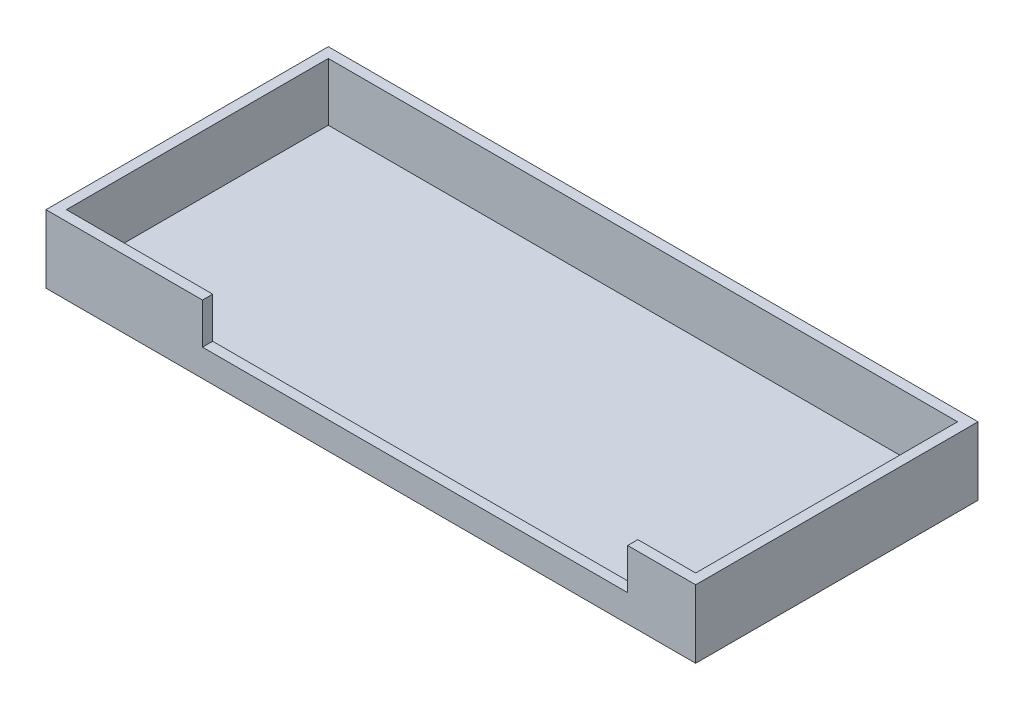
ISO-10303-21;
HEADER;
FILE_DESCRIPTION(('STEP AP214'),'2;1');
FILE_NAME('part.step','',(''),(''),'','','');
FILE_SCHEMA(('AUTOMOTIVE_DESIGN { 1 0 10303 214 1 1 1 1 }'));
ENDSEC;
DATA;
#1=APPLICATION_CONTEXT('core data for automotive mechanical design processes');
#2=APPLICATION_PROTOCOL_DEFINITION('international standard','automotive_design',2000,#1);
#3=PRODUCT_CONTEXT('',#1,'mechanical');
#4=PRODUCT('Part','Part','',(#3));
#5=PRODUCT_RELATED_PRODUCT_CATEGORY('part','',(#4));
#6=PRODUCT_DEFINITION_FORMATION('','',#4);
#7=PRODUCT_DEFINITION_CONTEXT('part definition',#1,'design');
#8=PRODUCT_DEFINITION('design','',#6,#7);
#9=PRODUCT_DEFINITION_SHAPE('','',#8);
#10=(LENGTH_UNIT() NAMED_UNIT(*) SI_UNIT(.MILLI.,.METRE.));
#11=(NAMED_UNIT(*) PLANE_ANGLE_UNIT() SI_UNIT($,.RADIAN.));
#12=(NAMED_UNIT(*) SI_UNIT($,.STERADIAN.) SOLID_ANGLE_UNIT());
#13=UNCERTAINTY_MEASURE_WITH_UNIT(LENGTH_MEASURE(1.E-05),#10,'distance_accuracy_value','');
#14=(GEOMETRIC_REPRESENTATION_CONTEXT(3) GLOBAL_UNCERTAINTY_ASSIGNED_CONTEXT((#13)) GLOBAL_UNIT_ASSIGNED_CONTEXT((#10,
#11,#12)) REPRESENTATION_CONTEXT('',''));
#15=CARTESIAN_POINT('',(0.,0.,0.));
#16=DIRECTION('',(0.,0.,1.));
#17=DIRECTION('',(1.,0.,0.));
#18=AXIS2_PLACEMENT_3D('',#15,#16,#17);
#19=CARTESIAN_POINT('',(-95.5,20.,-41.5));
#20=DIRECTION('',(1.,0.,0.));
#21=DIRECTION('',(0.,0.,-1.));
#22=AXIS2_PLACEMENT_3D('',#19,#20,#21);
#23=PLANE('',#22);
#24=DIRECTION('',(0.,0.,1.));
#25=VECTOR('',#24,1.);
#26=CARTESIAN_POINT('',(-95.5,0.,-41.5));
#27=LINE('',#26,#25);
#28=CARTESIAN_POINT('',(-95.5,0.,-41.5));
#29=VERTEX_POINT('',#28);
#30=CARTESIAN_POINT('',(-95.5,0.,41.5));
#31=VERTEX_POINT('',#30);
#32=EDGE_CURVE('E203',#29,#31,#27,.T.);
#33=ORIENTED_EDGE('',*,*,#32,.T.);
#34=DIRECTION('',(0.,-1.,0.));
#35=VECTOR('',#34,1.);
#36=CARTESIAN_POINT('',(-95.5,20.,41.5));
#37=LINE('',#36,#35);
#38=CARTESIAN_POINT('',(-95.5,20.,41.5));
#39=VERTEX_POINT('',#38);
#40=EDGE_CURVE('E251',#39,#31,#37,.T.);
#41=ORIENTED_EDGE('',*,*,#40,.F.);
#42=DIRECTION('',(0.,0.,1.));
#43=VECTOR('',#42,1.);
#44=CARTESIAN_POINT('',(-95.5,20.,-41.5));
#45=LINE('',#44,#43);
#46=CARTESIAN_POINT('',(-95.5,20.,-41.5));
#47=VERTEX_POINT('',#46);
#48=EDGE_CURVE('E213',#47,#39,#45,.T.);
#49=ORIENTED_EDGE('',*,*,#48,.F.);
#50=DIRECTION('',(0.,-1.,0.));
#51=VECTOR('',#50,1.);
#52=CARTESIAN_POINT('',(-95.5,20.,-41.5));
#53=LINE('',#52,#51);
#54=EDGE_CURVE('E228',#47,#29,#53,.T.);
#55=ORIENTED_EDGE('',*,*,#54,.T.);
#56=EDGE_LOOP('',(#33,#41,#49,#55));
#57=FACE_BOUND('',#56,.T.);
#58=ADVANCED_FACE('F45',(#57),#23,.F.);
#59=CARTESIAN_POINT('',(95.5,20.,41.5));
#60=DIRECTION('',(0.,0.,-1.));
#61=DIRECTION('',(-1.,0.,0.));
#62=AXIS2_PLACEMENT_3D('',#59,#60,#61);
#63=PLANE('',#62);
#64=DIRECTION('',(1.,0.,0.));
#65=VECTOR('',#64,1.);
#66=CARTESIAN_POINT('',(75.5,7.99476178157527,41.5));
#67=LINE('',#66,#65);
#68=CARTESIAN_POINT('',(-49.5,7.99476178157525,41.5));
#69=VERTEX_POINT('',#68);
#70=CARTESIAN_POINT('',(75.5,7.99476178157527,41.5));
#71=VERTEX_POINT('',#70);
#72=EDGE_CURVE('E144',#69,#71,#67,.T.);
#73=ORIENTED_EDGE('',*,*,#72,.F.);
#74=DIRECTION('',(0.,-1.,0.));
#75=VECTOR('',#74,1.);
#76=CARTESIAN_POINT('',(-49.5,29.4006189867323,41.5));
#77=LINE('',#76,#75);
#78=CARTESIAN_POINT('',(-49.5,20.,41.5));
#79=VERTEX_POINT('',#78);
#80=EDGE_CURVE('E134',#79,#69,#77,.T.);
#81=ORIENTED_EDGE('',*,*,#80,.F.);
#82=DIRECTION('',(1.,0.,0.));
#83=VECTOR('',#82,1.);
#84=CARTESIAN_POINT('',(95.5,20.,41.5));
#85=LINE('',#84,#83);
#86=EDGE_CURVE('E219',#39,#79,#85,.T.);
#87=ORIENTED_EDGE('',*,*,#86,.F.);
#88=ORIENTED_EDGE('',*,*,#40,.T.);
#89=DIRECTION('',(1.,0.,0.));
#90=VECTOR('',#89,1.);
#91=CARTESIAN_POINT('',(95.5,0.,41.5));
#92=LINE('',#91,#90);
#93=CARTESIAN_POINT('',(95.5,0.,41.5));
#94=VERTEX_POINT('',#93);
#95=EDGE_CURVE('E232',#31,#94,#92,.T.);
#96=ORIENTED_EDGE('',*,*,#95,.T.);
#97=DIRECTION('',(0.,-1.,0.));
#98=VECTOR('',#97,1.);
#99=CARTESIAN_POINT('',(95.5,20.,41.5));
#100=LINE('',#99,#98);
#101=CARTESIAN_POINT('',(95.5,20.,41.5));
#102=VERTEX_POINT('',#101);
#103=EDGE_CURVE('E247',#102,#94,#100,.T.);
#104=ORIENTED_EDGE('',*,*,#103,.F.);
#105=CARTESIAN_POINT('',(75.5,20.,41.5));
#106=VERTEX_POINT('',#105);
#107=EDGE_CURVE('E217',#106,#102,#85,.T.);
#108=ORIENTED_EDGE('',*,*,#107,.F.);
#109=DIRECTION('',(0.,1.,0.));
#110=VECTOR('',#109,1.);
#111=CARTESIAN_POINT('',(75.5,29.4006189867323,41.5));
#112=LINE('',#111,#110);
#113=EDGE_CURVE('E151',#71,#106,#112,.T.);
#114=ORIENTED_EDGE('',*,*,#113,.F.);
#115=EDGE_LOOP('',(#73,#81,#87,#88,#96,#104,#108,#114));
#116=FACE_BOUND('',#115,.T.);
#117=ADVANCED_FACE('F153',(#116),#63,.F.);
#118=CARTESIAN_POINT('',(95.5,20.,-41.5));
#119=DIRECTION('',(-1.,0.,0.));
#120=DIRECTION('',(0.,0.,1.));
#121=AXIS2_PLACEMENT_3D('',#118,#119,#120);
#122=PLANE('',#121);
#123=DIRECTION('',(0.,0.,-1.));
#124=VECTOR('',#123,1.);
#125=CARTESIAN_POINT('',(95.5,0.,-41.5));
#126=LINE('',#125,#124);
#127=CARTESIAN_POINT('',(95.5,0.,-41.5));
#128=VERTEX_POINT('',#127);
#129=EDGE_CURVE('E235',#94,#128,#126,.T.);
#130=ORIENTED_EDGE('',*,*,#129,.T.);
#131=DIRECTION('',(0.,-1.,0.));
#132=VECTOR('',#131,1.);
#133=CARTESIAN_POINT('',(95.5,20.,-41.5));
#134=LINE('',#133,#132);
#135=CARTESIAN_POINT('',(95.5,20.,-41.5));
#136=VERTEX_POINT('',#135);
#137=EDGE_CURVE('E243',#136,#128,#134,.T.);
#138=ORIENTED_EDGE('',*,*,#137,.F.);
#139=DIRECTION('',(0.,0.,-1.));
#140=VECTOR('',#139,1.);
#141=CARTESIAN_POINT('',(95.5,20.,-41.5));
#142=LINE('',#141,#140);
#143=EDGE_CURVE('E222',#102,#136,#142,.T.);
#144=ORIENTED_EDGE('',*,*,#143,.F.);
#145=ORIENTED_EDGE('',*,*,#103,.T.);
#146=EDGE_LOOP('',(#130,#138,#144,#145));
#147=FACE_BOUND('',#146,.T.);
#148=ADVANCED_FACE('F273',(#147),#122,.F.);
#149=CARTESIAN_POINT('',(95.5,20.,-41.5));
#150=DIRECTION('',(0.,0.,1.));
#151=DIRECTION('',(1.,0.,0.));
#152=AXIS2_PLACEMENT_3D('',#149,#150,#151);
#153=PLANE('',#152);
#154=DIRECTION('',(-1.,0.,0.));
#155=VECTOR('',#154,1.);
#156=CARTESIAN_POINT('',(95.5,0.,-41.5));
#157=LINE('',#156,#155);
#158=EDGE_CURVE('E218',#128,#29,#157,.T.);
#159=ORIENTED_EDGE('',*,*,#158,.T.);
#160=ORIENTED_EDGE('',*,*,#54,.F.);
#161=DIRECTION('',(-1.,0.,0.));
#162=VECTOR('',#161,1.);
#163=CARTESIAN_POINT('',(95.5,20.,-41.5));
#164=LINE('',#163,#162);
#165=EDGE_CURVE('E225',#136,#47,#164,.T.);
#166=ORIENTED_EDGE('',*,*,#165,.F.);
#167=ORIENTED_EDGE('',*,*,#137,.T.);
#168=EDGE_LOOP('',(#159,#160,#166,#167));
#169=FACE_BOUND('',#168,.T.);
#170=ADVANCED_FACE('F278',(#169),#153,.F.);
#171=CARTESIAN_POINT('',(0.,20.,0.));
#172=DIRECTION('',(0.,-1.,0.));
#173=DIRECTION('',(0.,0.,-1.));
#174=AXIS2_PLACEMENT_3D('',#171,#172,#173);
#175=PLANE('',#174);
#176=ORIENTED_EDGE('',*,*,#86,.T.);
#177=DIRECTION('',(0.,0.,-1.));
#178=VECTOR('',#177,1.);
#179=CARTESIAN_POINT('',(-49.5,20.,0.));
#180=LINE('',#179,#178);
#181=CARTESIAN_POINT('',(-49.5,20.,38.5));
#182=VERTEX_POINT('',#181);
#183=EDGE_CURVE('E139',#79,#182,#180,.T.);
#184=ORIENTED_EDGE('',*,*,#183,.T.);
#185=DIRECTION('',(1.,0.,0.));
#186=VECTOR('',#185,1.);
#187=CARTESIAN_POINT('',(92.5,20.,38.5));
#188=LINE('',#187,#186);
#189=CARTESIAN_POINT('',(-92.5,20.,38.5));
#190=VERTEX_POINT('',#189);
#191=EDGE_CURVE('E189',#190,#182,#188,.T.);
#192=ORIENTED_EDGE('',*,*,#191,.F.);
#193=DIRECTION('',(0.,0.,1.));
#194=VECTOR('',#193,1.);
#195=CARTESIAN_POINT('',(-92.5,20.,-38.5));
#196=LINE('',#195,#194);
#197=CARTESIAN_POINT('',(-92.5,20.,-38.5));
#198=VERTEX_POINT('',#197);
#199=EDGE_CURVE('E68',#198,#190,#196,.T.);
#200=ORIENTED_EDGE('',*,*,#199,.F.);
#201=DIRECTION('',(-1.,0.,0.));
#202=VECTOR('',#201,1.);
#203=CARTESIAN_POINT('',(92.5,20.,-38.5));
#204=LINE('',#203,#202);
#205=CARTESIAN_POINT('',(92.5,20.,-38.5));
#206=VERTEX_POINT('',#205);
#207=EDGE_CURVE('E173',#206,#198,#204,.T.);
#208=ORIENTED_EDGE('',*,*,#207,.F.);
#209=DIRECTION('',(0.,0.,-1.));
#210=VECTOR('',#209,1.);
#211=CARTESIAN_POINT('',(92.5,20.,-38.5));
#212=LINE('',#211,#210);
#213=CARTESIAN_POINT('',(92.5,20.,38.5));
#214=VERTEX_POINT('',#213);
#215=EDGE_CURVE('E193',#214,#206,#212,.T.);
#216=ORIENTED_EDGE('',*,*,#215,.F.);
#217=CARTESIAN_POINT('',(75.5,20.,38.5));
#218=VERTEX_POINT('',#217);
#219=EDGE_CURVE('E188',#218,#214,#188,.T.);
#220=ORIENTED_EDGE('',*,*,#219,.F.);
#221=DIRECTION('',(0.,0.,1.));
#222=VECTOR('',#221,1.);
#223=CARTESIAN_POINT('',(75.5,20.,0.));
#224=LINE('',#223,#222);
#225=EDGE_CURVE('E161',#218,#106,#224,.T.);
#226=ORIENTED_EDGE('',*,*,#225,.T.);
#227=ORIENTED_EDGE('',*,*,#107,.T.);
#228=ORIENTED_EDGE('',*,*,#143,.T.);
#229=ORIENTED_EDGE('',*,*,#165,.T.);
#230=ORIENTED_EDGE('',*,*,#48,.T.);
#231=EDGE_LOOP('',(#176,#184,#192,#200,#208,#216,#220,#226,#227,#228,#229,#230));
#232=FACE_BOUND('',#231,.T.);
#233=ADVANCED_FACE('F264',(#232),#175,.F.);
#234=CARTESIAN_POINT('',(0.,0.,0.));
#235=DIRECTION('',(0.,-1.,0.));
#236=DIRECTION('',(0.,0.,-1.));
#237=AXIS2_PLACEMENT_3D('',#234,#235,#236);
#238=PLANE('',#237);
#239=ORIENTED_EDGE('',*,*,#32,.F.);
#240=ORIENTED_EDGE('',*,*,#158,.F.);
#241=ORIENTED_EDGE('',*,*,#129,.F.);
#242=ORIENTED_EDGE('',*,*,#95,.F.);
#243=EDGE_LOOP('',(#239,#240,#241,#242));
#244=FACE_BOUND('',#243,.T.);
#245=ADVANCED_FACE('F284',(#244),#238,.T.);
#246=CARTESIAN_POINT('',(-92.5,3.,-38.5));
#247=DIRECTION('',(-1.,0.,0.));
#248=DIRECTION('',(0.,0.,1.));
#249=AXIS2_PLACEMENT_3D('',#246,#247,#248);
#250=PLANE('',#249);
#251=ORIENTED_EDGE('',*,*,#199,.T.);
#252=DIRECTION('',(0.,1.,0.));
#253=VECTOR('',#252,1.);
#254=CARTESIAN_POINT('',(-92.5,3.,38.5));
#255=LINE('',#254,#253);
#256=CARTESIAN_POINT('',(-92.5,3.,38.5));
#257=VERTEX_POINT('',#256);
#258=EDGE_CURVE('E185',#257,#190,#255,.T.);
#259=ORIENTED_EDGE('',*,*,#258,.F.);
#260=DIRECTION('',(0.,0.,1.));
#261=VECTOR('',#260,1.);
#262=CARTESIAN_POINT('',(-92.5,3.,-38.5));
#263=LINE('',#262,#261);
#264=CARTESIAN_POINT('',(-92.5,3.,-38.5));
#265=VERTEX_POINT('',#264);
#266=EDGE_CURVE('E168',#265,#257,#263,.T.);
#267=ORIENTED_EDGE('',*,*,#266,.F.);
#268=DIRECTION('',(0.,1.,0.));
#269=VECTOR('',#268,1.);
#270=CARTESIAN_POINT('',(-92.5,3.,-38.5));
#271=LINE('',#270,#269);
#272=EDGE_CURVE('E200',#265,#198,#271,.T.);
#273=ORIENTED_EDGE('',*,*,#272,.T.);
#274=EDGE_LOOP('',(#251,#259,#267,#273));
#275=FACE_BOUND('',#274,.T.);
#276=ADVANCED_FACE('F286',(#275),#250,.F.);
#277=CARTESIAN_POINT('',(92.5,3.,-38.5));
#278=DIRECTION('',(0.,0.,-1.));
#279=DIRECTION('',(-1.,0.,0.));
#280=AXIS2_PLACEMENT_3D('',#277,#278,#279);
#281=PLANE('',#280);
#282=ORIENTED_EDGE('',*,*,#207,.T.);
#283=ORIENTED_EDGE('',*,*,#272,.F.);
#284=DIRECTION('',(-1.,0.,0.));
#285=VECTOR('',#284,1.);
#286=CARTESIAN_POINT('',(92.5,3.,-38.5));
#287=LINE('',#286,#285);
#288=CARTESIAN_POINT('',(92.5,3.,-38.5));
#289=VERTEX_POINT('',#288);
#290=EDGE_CURVE('E181',#289,#265,#287,.T.);
#291=ORIENTED_EDGE('',*,*,#290,.F.);
#292=DIRECTION('',(0.,1.,0.));
#293=VECTOR('',#292,1.);
#294=CARTESIAN_POINT('',(92.5,3.,-38.5));
#295=LINE('',#294,#293);
#296=EDGE_CURVE('E204',#289,#206,#295,.T.);
#297=ORIENTED_EDGE('',*,*,#296,.T.);
#298=EDGE_LOOP('',(#282,#283,#291,#297));
#299=FACE_BOUND('',#298,.T.);
#300=ADVANCED_FACE('F292',(#299),#281,.F.);
#301=CARTESIAN_POINT('',(92.5,3.,-38.5));
#302=DIRECTION('',(1.,0.,0.));
#303=DIRECTION('',(0.,0.,-1.));
#304=AXIS2_PLACEMENT_3D('',#301,#302,#303);
#305=PLANE('',#304);
#306=ORIENTED_EDGE('',*,*,#215,.T.);
#307=ORIENTED_EDGE('',*,*,#296,.F.);
#308=DIRECTION('',(0.,0.,-1.));
#309=VECTOR('',#308,1.);
#310=CARTESIAN_POINT('',(92.5,3.,-38.5));
#311=LINE('',#310,#309);
#312=CARTESIAN_POINT('',(92.5,3.,38.5));
#313=VERTEX_POINT('',#312);
#314=EDGE_CURVE('E177',#313,#289,#311,.T.);
#315=ORIENTED_EDGE('',*,*,#314,.F.);
#316=DIRECTION('',(0.,1.,0.));
#317=VECTOR('',#316,1.);
#318=CARTESIAN_POINT('',(92.5,3.,38.5));
#319=LINE('',#318,#317);
#320=EDGE_CURVE('E207',#313,#214,#319,.T.);
#321=ORIENTED_EDGE('',*,*,#320,.T.);
#322=EDGE_LOOP('',(#306,#307,#315,#321));
#323=FACE_BOUND('',#322,.T.);
#324=ADVANCED_FACE('F345',(#323),#305,.F.);
#325=CARTESIAN_POINT('',(92.5,3.,38.5));
#326=DIRECTION('',(0.,0.,1.));
#327=DIRECTION('',(1.,0.,0.));
#328=AXIS2_PLACEMENT_3D('',#325,#326,#327);
#329=PLANE('',#328);
#330=ORIENTED_EDGE('',*,*,#191,.T.);
#331=DIRECTION('',(0.,-1.,0.));
#332=VECTOR('',#331,1.);
#333=CARTESIAN_POINT('',(-49.5,3.,38.5));
#334=LINE('',#333,#332);
#335=CARTESIAN_POINT('',(-49.5,7.99476178157525,38.5));
#336=VERTEX_POINT('',#335);
#337=EDGE_CURVE('E11',#182,#336,#334,.T.);
#338=ORIENTED_EDGE('',*,*,#337,.T.);
#339=DIRECTION('',(1.,0.,0.));
#340=VECTOR('',#339,1.);
#341=CARTESIAN_POINT('',(92.5,7.99476178157527,38.5));
#342=LINE('',#341,#340);
#343=CARTESIAN_POINT('',(75.5,7.99476178157527,38.5));
#344=VERTEX_POINT('',#343);
#345=EDGE_CURVE('E149',#336,#344,#342,.T.);
#346=ORIENTED_EDGE('',*,*,#345,.T.);
#347=DIRECTION('',(0.,1.,0.));
#348=VECTOR('',#347,1.);
#349=CARTESIAN_POINT('',(75.5,3.,38.5));
#350=LINE('',#349,#348);
#351=EDGE_CURVE('E53',#344,#218,#350,.T.);
#352=ORIENTED_EDGE('',*,*,#351,.T.);
#353=ORIENTED_EDGE('',*,*,#219,.T.);
#354=ORIENTED_EDGE('',*,*,#320,.F.);
#355=DIRECTION('',(1.,0.,0.));
#356=VECTOR('',#355,1.);
#357=CARTESIAN_POINT('',(92.5,3.,38.5));
#358=LINE('',#357,#356);
#359=EDGE_CURVE('E172',#257,#313,#358,.T.);
#360=ORIENTED_EDGE('',*,*,#359,.F.);
#361=ORIENTED_EDGE('',*,*,#258,.T.);
#362=EDGE_LOOP('',(#330,#338,#346,#352,#353,#354,#360,#361));
#363=FACE_BOUND('',#362,.T.);
#364=ADVANCED_FACE('F260',(#363),#329,.F.);
#365=CARTESIAN_POINT('',(0.,3.,0.));
#366=DIRECTION('',(0.,-1.,0.));
#367=DIRECTION('',(0.,0.,-1.));
#368=AXIS2_PLACEMENT_3D('',#365,#366,#367);
#369=PLANE('',#368);
#370=ORIENTED_EDGE('',*,*,#266,.T.);
#371=ORIENTED_EDGE('',*,*,#359,.T.);
#372=ORIENTED_EDGE('',*,*,#314,.T.);
#373=ORIENTED_EDGE('',*,*,#290,.T.);
#374=EDGE_LOOP('',(#370,#371,#372,#373));
#375=FACE_BOUND('',#374,.T.);
#376=ADVANCED_FACE('F362',(#375),#369,.F.);
#377=CARTESIAN_POINT('',(-49.5,29.4006189867323,24.5));
#378=DIRECTION('',(-1.,0.,0.));
#379=DIRECTION('',(0.,0.,1.));
#380=AXIS2_PLACEMENT_3D('',#377,#378,#379);
#381=PLANE('',#380);
#382=ORIENTED_EDGE('',*,*,#80,.T.);
#383=DIRECTION('',(0.,0.,1.));
#384=VECTOR('',#383,1.);
#385=CARTESIAN_POINT('',(-49.5,7.99476178157525,24.5));
#386=LINE('',#385,#384);
#387=EDGE_CURVE('E137',#336,#69,#386,.T.);
#388=ORIENTED_EDGE('',*,*,#387,.F.);
#389=ORIENTED_EDGE('',*,*,#337,.F.);
#390=ORIENTED_EDGE('',*,*,#183,.F.);
#391=EDGE_LOOP('',(#382,#388,#389,#390));
#392=FACE_BOUND('',#391,.T.);
#393=ADVANCED_FACE('F136',(#392),#381,.F.);
#394=CARTESIAN_POINT('',(75.5,29.4006189867323,24.5));
#395=DIRECTION('',(1.,0.,0.));
#396=DIRECTION('',(0.,0.,-1.));
#397=AXIS2_PLACEMENT_3D('',#394,#395,#396);
#398=PLANE('',#397);
#399=ORIENTED_EDGE('',*,*,#351,.F.);
#400=DIRECTION('',(0.,0.,1.));
#401=VECTOR('',#400,1.);
#402=CARTESIAN_POINT('',(75.5,7.99476178157527,24.5));
#403=LINE('',#402,#401);
#404=EDGE_CURVE('E60',#344,#71,#403,.T.);
#405=ORIENTED_EDGE('',*,*,#404,.T.);
#406=ORIENTED_EDGE('',*,*,#113,.T.);
#407=ORIENTED_EDGE('',*,*,#225,.F.);
#408=EDGE_LOOP('',(#399,#405,#406,#407));
#409=FACE_BOUND('',#408,.T.);
#410=ADVANCED_FACE('F377',(#409),#398,.F.);
#411=CARTESIAN_POINT('',(75.5,7.99476178157527,24.5));
#412=DIRECTION('',(0.,-1.,0.));
#413=DIRECTION('',(1.,0.,0.));
#414=AXIS2_PLACEMENT_3D('',#411,#412,#413);
#415=PLANE('',#414);
#416=ORIENTED_EDGE('',*,*,#387,.T.);
#417=ORIENTED_EDGE('',*,*,#72,.T.);
#418=ORIENTED_EDGE('',*,*,#404,.F.);
#419=ORIENTED_EDGE('',*,*,#345,.F.);
#420=EDGE_LOOP('',(#416,#417,#418,#419));
#421=FACE_BOUND('',#420,.T.);
#422=ADVANCED_FACE('F146',(#421),#415,.F.);
#423=CLOSED_SHELL('',(#58,#117,#148,#170,#233,#245,#276,#300,#324,#364,#376,#393,#410,#422));
#424=MANIFOLD_SOLID_BREP('B2',#423);
#425=ADVANCED_BREP_SHAPE_REPRESENTATION('',(#18,#424),#14);
#426=SHAPE_DEFINITION_REPRESENTATION(#9,#425);
ENDSEC;
END-ISO-10303-21;
